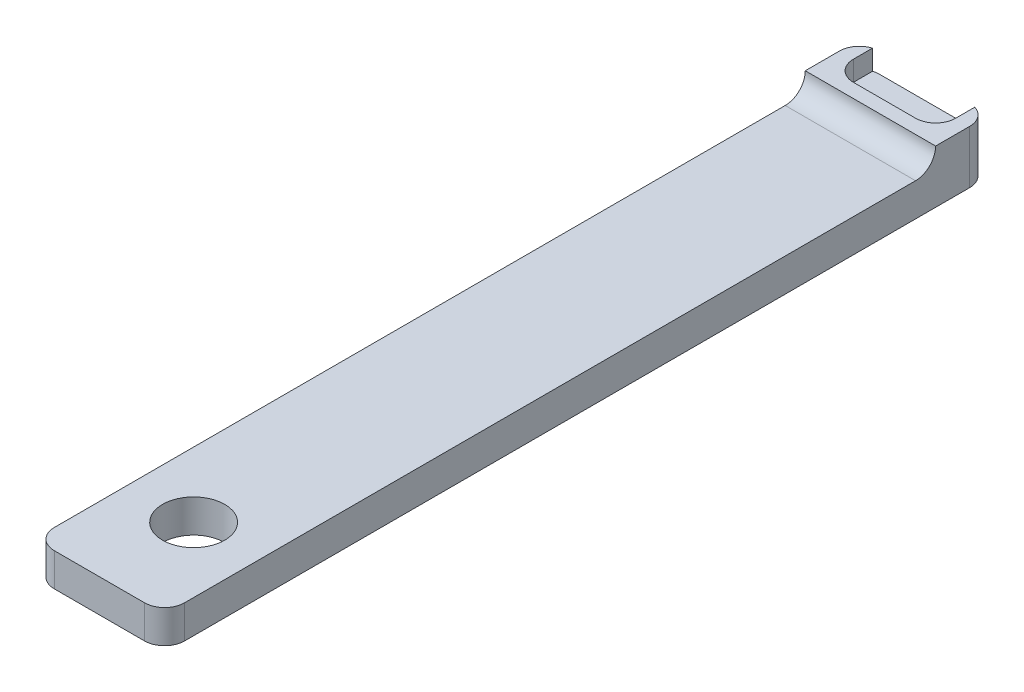
ISO-10303-21;
HEADER;
FILE_DESCRIPTION(('STEP AP214'),'2;1');
FILE_NAME('part.step','',(''),(''),'','','');
FILE_SCHEMA(('AUTOMOTIVE_DESIGN { 1 0 10303 214 1 1 1 1 }'));
ENDSEC;
DATA;
#1=APPLICATION_CONTEXT('core data for automotive mechanical design processes');
#2=APPLICATION_PROTOCOL_DEFINITION('international standard','automotive_design',2000,#1);
#3=PRODUCT_CONTEXT('',#1,'mechanical');
#4=PRODUCT('Part','Part','',(#3));
#5=PRODUCT_RELATED_PRODUCT_CATEGORY('part','',(#4));
#6=PRODUCT_DEFINITION_FORMATION('','',#4);
#7=PRODUCT_DEFINITION_CONTEXT('part definition',#1,'design');
#8=PRODUCT_DEFINITION('design','',#6,#7);
#9=PRODUCT_DEFINITION_SHAPE('','',#8);
#10=(LENGTH_UNIT() NAMED_UNIT(*) SI_UNIT(.MILLI.,.METRE.));
#11=(NAMED_UNIT(*) PLANE_ANGLE_UNIT() SI_UNIT($,.RADIAN.));
#12=(NAMED_UNIT(*) SI_UNIT($,.STERADIAN.) SOLID_ANGLE_UNIT());
#13=UNCERTAINTY_MEASURE_WITH_UNIT(LENGTH_MEASURE(1.E-05),#10,'distance_accuracy_value','');
#14=(GEOMETRIC_REPRESENTATION_CONTEXT(3) GLOBAL_UNCERTAINTY_ASSIGNED_CONTEXT((#13)) GLOBAL_UNIT_ASSIGNED_CONTEXT((#10,
#11,#12)) REPRESENTATION_CONTEXT('',''));
#15=CARTESIAN_POINT('',(0.,0.,0.));
#16=DIRECTION('',(0.,0.,1.));
#17=DIRECTION('',(1.,0.,0.));
#18=AXIS2_PLACEMENT_3D('',#15,#16,#17);
#19=CARTESIAN_POINT('',(0.,1.65,0.));
#20=DIRECTION('',(0.,-1.,0.));
#21=DIRECTION('',(0.,0.,-1.));
#22=AXIS2_PLACEMENT_3D('',#19,#20,#21);
#23=PLANE('',#22);
#24=DIRECTION('',(0.,0.,1.));
#25=VECTOR('',#24,1.);
#26=CARTESIAN_POINT('',(5.8,1.65,-41.15));
#27=LINE('',#26,#25);
#28=CARTESIAN_POINT('',(5.8,1.65,-41.1039392014169));
#29=VERTEX_POINT('',#28);
#30=CARTESIAN_POINT('',(5.8,1.65,-40.15));
#31=VERTEX_POINT('',#30);
#32=EDGE_CURVE('E191',#29,#31,#27,.T.);
#33=ORIENTED_EDGE('',*,*,#32,.F.);
#34=CARTESIAN_POINT('',(5.5,1.65,-40.15));
#35=DIRECTION('',(0.,-1.,0.));
#36=DIRECTION('',(0.,0.,-1.));
#37=AXIS2_PLACEMENT_3D('',#34,#35,#36);
#38=CIRCLE('',#37,1.);
#39=CARTESIAN_POINT('',(5.5,1.65,-41.15));
#40=VERTEX_POINT('',#39);
#41=EDGE_CURVE('E255',#29,#40,#38,.F.);
#42=ORIENTED_EDGE('',*,*,#41,.T.);
#43=DIRECTION('',(-1.,0.,0.));
#44=VECTOR('',#43,1.);
#45=CARTESIAN_POINT('',(0.,1.65,-41.15));
#46=LINE('',#45,#44);
#47=CARTESIAN_POINT('',(1.,1.65,-41.15));
#48=VERTEX_POINT('',#47);
#49=EDGE_CURVE('E212',#40,#48,#46,.T.);
#50=ORIENTED_EDGE('',*,*,#49,.T.);
#51=CARTESIAN_POINT('',(1.,1.65,-40.15));
#52=DIRECTION('',(0.,-1.,0.));
#53=DIRECTION('',(0.,0.,-1.));
#54=AXIS2_PLACEMENT_3D('',#51,#52,#53);
#55=CIRCLE('',#54,1.);
#56=CARTESIAN_POINT('',(0.7,1.65,-41.1039392014169));
#57=VERTEX_POINT('',#56);
#58=EDGE_CURVE('E253',#48,#57,#55,.F.);
#59=ORIENTED_EDGE('',*,*,#58,.T.);
#60=DIRECTION('',(0.,0.,-1.));
#61=VECTOR('',#60,1.);
#62=CARTESIAN_POINT('',(0.7,1.65,-41.15));
#63=LINE('',#62,#61);
#64=CARTESIAN_POINT('',(0.7,1.65,-40.15));
#65=VERTEX_POINT('',#64);
#66=EDGE_CURVE('E175',#65,#57,#63,.T.);
#67=ORIENTED_EDGE('',*,*,#66,.F.);
#68=CARTESIAN_POINT('',(1.7,1.65,-40.15));
#69=DIRECTION('',(0.,-1.,0.));
#70=DIRECTION('',(0.,0.,-1.));
#71=AXIS2_PLACEMENT_3D('',#68,#69,#70);
#72=CIRCLE('',#71,1.);
#73=CARTESIAN_POINT('',(1.7,1.65,-39.15));
#74=VERTEX_POINT('',#73);
#75=EDGE_CURVE('E251',#65,#74,#72,.F.);
#76=ORIENTED_EDGE('',*,*,#75,.T.);
#77=DIRECTION('',(-1.,0.,0.));
#78=VECTOR('',#77,1.);
#79=CARTESIAN_POINT('',(0.7,1.65,-39.15));
#80=LINE('',#79,#78);
#81=CARTESIAN_POINT('',(4.8,1.65,-39.15));
#82=VERTEX_POINT('',#81);
#83=EDGE_CURVE('E194',#82,#74,#80,.T.);
#84=ORIENTED_EDGE('',*,*,#83,.F.);
#85=CARTESIAN_POINT('',(4.8,1.65,-40.15));
#86=DIRECTION('',(0.,-1.,0.));
#87=DIRECTION('',(0.,0.,-1.));
#88=AXIS2_PLACEMENT_3D('',#85,#86,#87);
#89=CIRCLE('',#88,1.);
#90=EDGE_CURVE('E249',#82,#31,#89,.F.);
#91=ORIENTED_EDGE('',*,*,#90,.T.);
#92=EDGE_LOOP('',(#33,#42,#50,#59,#67,#76,#84,#91));
#93=FACE_BOUND('',#92,.T.);
#94=ADVANCED_FACE('F39',(#93),#23,.F.);
#95=CARTESIAN_POINT('',(3.25,1.65,-4.7));
#96=DIRECTION('',(0.,1.,0.));
#97=DIRECTION('',(0.,0.,1.));
#98=AXIS2_PLACEMENT_3D('',#95,#96,#97);
#99=CIRCLE('',#98,1.55);
#100=CARTESIAN_POINT('',(3.25,1.65,-3.15));
#101=VERTEX_POINT('',#100);
#102=EDGE_CURVE('E199',#101,#101,#99,.T.);
#103=ORIENTED_EDGE('',*,*,#102,.F.);
#104=EDGE_LOOP('',(#103));
#105=FACE_BOUND('',#104,.T.);
#106=DIRECTION('',(1.,0.,0.));
#107=VECTOR('',#106,1.);
#108=CARTESIAN_POINT('',(0.,1.65,0.));
#109=LINE('',#108,#107);
#110=CARTESIAN_POINT('',(1.,1.65,0.));
#111=VERTEX_POINT('',#110);
#112=CARTESIAN_POINT('',(5.5,1.65,0.));
#113=VERTEX_POINT('',#112);
#114=EDGE_CURVE('E206',#111,#113,#109,.T.);
#115=ORIENTED_EDGE('',*,*,#114,.T.);
#116=CARTESIAN_POINT('',(5.5,1.65,-1.));
#117=DIRECTION('',(0.,-1.,0.));
#118=DIRECTION('',(0.,0.,-1.));
#119=AXIS2_PLACEMENT_3D('',#116,#117,#118);
#120=CIRCLE('',#119,1.);
#121=CARTESIAN_POINT('',(6.5,1.65,-1.));
#122=VERTEX_POINT('',#121);
#123=EDGE_CURVE('E273',#113,#122,#120,.F.);
#124=ORIENTED_EDGE('',*,*,#123,.T.);
#125=DIRECTION('',(0.,0.,-1.));
#126=VECTOR('',#125,1.);
#127=CARTESIAN_POINT('',(6.5,1.65,0.));
#128=LINE('',#127,#126);
#129=CARTESIAN_POINT('',(6.5,1.65,-37.45));
#130=VERTEX_POINT('',#129);
#131=EDGE_CURVE('E209',#122,#130,#128,.T.);
#132=ORIENTED_EDGE('',*,*,#131,.T.);
#133=DIRECTION('',(1.,0.,0.));
#134=VECTOR('',#133,1.);
#135=CARTESIAN_POINT('',(0.,1.65,-37.45));
#136=LINE('',#135,#134);
#137=CARTESIAN_POINT('',(0.,1.65,-37.45));
#138=VERTEX_POINT('',#137);
#139=EDGE_CURVE('E270',#130,#138,#136,.F.);
#140=ORIENTED_EDGE('',*,*,#139,.T.);
#141=DIRECTION('',(0.,0.,1.));
#142=VECTOR('',#141,1.);
#143=CARTESIAN_POINT('',(0.,1.65,0.));
#144=LINE('',#143,#142);
#145=CARTESIAN_POINT('',(0.,1.65,-1.));
#146=VERTEX_POINT('',#145);
#147=EDGE_CURVE('E160',#138,#146,#144,.T.);
#148=ORIENTED_EDGE('',*,*,#147,.T.);
#149=CARTESIAN_POINT('',(1.,1.65,-1.));
#150=DIRECTION('',(0.,-1.,0.));
#151=DIRECTION('',(0.,0.,-1.));
#152=AXIS2_PLACEMENT_3D('',#149,#150,#151);
#153=CIRCLE('',#152,1.);
#154=EDGE_CURVE('E61',#146,#111,#153,.F.);
#155=ORIENTED_EDGE('',*,*,#154,.T.);
#156=EDGE_LOOP('',(#115,#124,#132,#140,#148,#155));
#157=FACE_BOUND('',#156,.T.);
#158=ADVANCED_FACE('F329',(#105,#157),#23,.F.);
#159=CARTESIAN_POINT('',(0.,0.,0.));
#160=DIRECTION('',(0.,-1.,0.));
#161=DIRECTION('',(0.,0.,-1.));
#162=AXIS2_PLACEMENT_3D('',#159,#160,#161);
#163=PLANE('',#162);
#164=DIRECTION('',(-1.,0.,0.));
#165=VECTOR('',#164,1.);
#166=CARTESIAN_POINT('',(0.,0.,-41.15));
#167=LINE('',#166,#165);
#168=CARTESIAN_POINT('',(5.5,0.,-41.15));
#169=VERTEX_POINT('',#168);
#170=CARTESIAN_POINT('',(1.,0.,-41.15));
#171=VERTEX_POINT('',#170);
#172=EDGE_CURVE('E207',#169,#171,#167,.T.);
#173=ORIENTED_EDGE('',*,*,#172,.F.);
#174=CARTESIAN_POINT('',(5.5,0.,-40.15));
#175=DIRECTION('',(0.,-1.,0.));
#176=DIRECTION('',(0.,0.,-1.));
#177=AXIS2_PLACEMENT_3D('',#174,#175,#176);
#178=CIRCLE('',#177,1.);
#179=CARTESIAN_POINT('',(6.5,0.,-40.15));
#180=VERTEX_POINT('',#179);
#181=EDGE_CURVE('E235',#169,#180,#178,.T.);
#182=ORIENTED_EDGE('',*,*,#181,.T.);
#183=DIRECTION('',(0.,0.,-1.));
#184=VECTOR('',#183,1.);
#185=CARTESIAN_POINT('',(6.5,0.,0.));
#186=LINE('',#185,#184);
#187=CARTESIAN_POINT('',(6.5,0.,-1.));
#188=VERTEX_POINT('',#187);
#189=EDGE_CURVE('E220',#188,#180,#186,.T.);
#190=ORIENTED_EDGE('',*,*,#189,.F.);
#191=CARTESIAN_POINT('',(5.5,0.,-1.));
#192=DIRECTION('',(0.,-1.,0.));
#193=DIRECTION('',(0.,0.,-1.));
#194=AXIS2_PLACEMENT_3D('',#191,#192,#193);
#195=CIRCLE('',#194,1.);
#196=CARTESIAN_POINT('',(5.5,0.,0.));
#197=VERTEX_POINT('',#196);
#198=EDGE_CURVE('E231',#188,#197,#195,.T.);
#199=ORIENTED_EDGE('',*,*,#198,.T.);
#200=DIRECTION('',(1.,0.,0.));
#201=VECTOR('',#200,1.);
#202=CARTESIAN_POINT('',(0.,0.,0.));
#203=LINE('',#202,#201);
#204=CARTESIAN_POINT('',(1.,0.,0.));
#205=VERTEX_POINT('',#204);
#206=EDGE_CURVE('E218',#205,#197,#203,.T.);
#207=ORIENTED_EDGE('',*,*,#206,.F.);
#208=CARTESIAN_POINT('',(1.,0.,-1.));
#209=DIRECTION('',(0.,-1.,0.));
#210=DIRECTION('',(0.,0.,-1.));
#211=AXIS2_PLACEMENT_3D('',#208,#209,#210);
#212=CIRCLE('',#211,1.);
#213=CARTESIAN_POINT('',(0.,0.,-1.));
#214=VERTEX_POINT('',#213);
#215=EDGE_CURVE('E229',#205,#214,#212,.T.);
#216=ORIENTED_EDGE('',*,*,#215,.T.);
#217=DIRECTION('',(0.,0.,1.));
#218=VECTOR('',#217,1.);
#219=CARTESIAN_POINT('',(0.,0.,0.));
#220=LINE('',#219,#218);
#221=CARTESIAN_POINT('',(0.,0.,-40.15));
#222=VERTEX_POINT('',#221);
#223=EDGE_CURVE('E202',#222,#214,#220,.T.);
#224=ORIENTED_EDGE('',*,*,#223,.F.);
#225=CARTESIAN_POINT('',(1.,0.,-40.15));
#226=DIRECTION('',(0.,-1.,0.));
#227=DIRECTION('',(0.,0.,-1.));
#228=AXIS2_PLACEMENT_3D('',#225,#226,#227);
#229=CIRCLE('',#228,1.);
#230=EDGE_CURVE('E233',#222,#171,#229,.T.);
#231=ORIENTED_EDGE('',*,*,#230,.T.);
#232=EDGE_LOOP('',(#173,#182,#190,#199,#207,#216,#224,#231));
#233=FACE_BOUND('',#232,.T.);
#234=CARTESIAN_POINT('',(3.25,0.,-4.7));
#235=DIRECTION('',(0.,1.,0.));
#236=DIRECTION('',(0.,0.,1.));
#237=AXIS2_PLACEMENT_3D('',#234,#235,#236);
#238=CIRCLE('',#237,1.55);
#239=CARTESIAN_POINT('',(3.25,0.,-3.15));
#240=VERTEX_POINT('',#239);
#241=EDGE_CURVE('E190',#240,#240,#238,.T.);
#242=ORIENTED_EDGE('',*,*,#241,.T.);
#243=EDGE_LOOP('',(#242));
#244=FACE_BOUND('',#243,.T.);
#245=ADVANCED_FACE('F321',(#233,#244),#163,.T.);
#246=CARTESIAN_POINT('',(0.,1.65,0.));
#247=DIRECTION('',(1.,0.,0.));
#248=DIRECTION('',(0.,0.,-1.));
#249=AXIS2_PLACEMENT_3D('',#246,#247,#248);
#250=PLANE('',#249);
#251=DIRECTION('',(0.,0.,1.));
#252=VECTOR('',#251,1.);
#253=CARTESIAN_POINT('',(0.,2.65,-41.15));
#254=LINE('',#253,#252);
#255=CARTESIAN_POINT('',(0.,2.65,-40.15));
#256=VERTEX_POINT('',#255);
#257=CARTESIAN_POINT('',(0.,2.65,-38.45));
#258=VERTEX_POINT('',#257);
#259=EDGE_CURVE('E158',#256,#258,#254,.T.);
#260=ORIENTED_EDGE('',*,*,#259,.F.);
#261=DIRECTION('',(0.,-1.,0.));
#262=VECTOR('',#261,1.);
#263=CARTESIAN_POINT('',(0.,1.65,-40.15));
#264=LINE('',#263,#262);
#265=EDGE_CURVE('E259',#256,#222,#264,.T.);
#266=ORIENTED_EDGE('',*,*,#265,.T.);
#267=ORIENTED_EDGE('',*,*,#223,.T.);
#268=DIRECTION('',(0.,-1.,0.));
#269=VECTOR('',#268,1.);
#270=CARTESIAN_POINT('',(0.,1.65,-1.));
#271=LINE('',#270,#269);
#272=EDGE_CURVE('E257',#214,#146,#271,.F.);
#273=ORIENTED_EDGE('',*,*,#272,.T.);
#274=ORIENTED_EDGE('',*,*,#147,.F.);
#275=CARTESIAN_POINT('',(0.,2.65,-37.45));
#276=DIRECTION('',(1.,0.,0.));
#277=DIRECTION('',(0.,0.,-1.));
#278=AXIS2_PLACEMENT_3D('',#275,#276,#277);
#279=CIRCLE('',#278,1.);
#280=EDGE_CURVE('E154',#138,#258,#279,.T.);
#281=ORIENTED_EDGE('',*,*,#280,.T.);
#282=EDGE_LOOP('',(#260,#266,#267,#273,#274,#281));
#283=FACE_BOUND('',#282,.T.);
#284=ADVANCED_FACE('F156',(#283),#250,.F.);
#285=CARTESIAN_POINT('',(0.,1.65,0.));
#286=DIRECTION('',(0.,0.,-1.));
#287=DIRECTION('',(-1.,0.,0.));
#288=AXIS2_PLACEMENT_3D('',#285,#286,#287);
#289=PLANE('',#288);
#290=ORIENTED_EDGE('',*,*,#206,.T.);
#291=DIRECTION('',(0.,-1.,0.));
#292=VECTOR('',#291,1.);
#293=CARTESIAN_POINT('',(5.5,1.65,0.));
#294=LINE('',#293,#292);
#295=EDGE_CURVE('E54',#197,#113,#294,.F.);
#296=ORIENTED_EDGE('',*,*,#295,.T.);
#297=ORIENTED_EDGE('',*,*,#114,.F.);
#298=DIRECTION('',(0.,-1.,0.));
#299=VECTOR('',#298,1.);
#300=CARTESIAN_POINT('',(1.,1.65,0.));
#301=LINE('',#300,#299);
#302=EDGE_CURVE('E266',#111,#205,#301,.T.);
#303=ORIENTED_EDGE('',*,*,#302,.T.);
#304=EDGE_LOOP('',(#290,#296,#297,#303));
#305=FACE_BOUND('',#304,.T.);
#306=ADVANCED_FACE('F327',(#305),#289,.F.);
#307=CARTESIAN_POINT('',(6.5,1.65,0.));
#308=DIRECTION('',(-1.,0.,0.));
#309=DIRECTION('',(0.,0.,1.));
#310=AXIS2_PLACEMENT_3D('',#307,#308,#309);
#311=PLANE('',#310);
#312=ORIENTED_EDGE('',*,*,#189,.T.);
#313=DIRECTION('',(0.,-1.,0.));
#314=VECTOR('',#313,1.);
#315=CARTESIAN_POINT('',(6.5,1.65,-40.15));
#316=LINE('',#315,#314);
#317=CARTESIAN_POINT('',(6.5,2.65,-40.15));
#318=VERTEX_POINT('',#317);
#319=EDGE_CURVE('E240',#180,#318,#316,.F.);
#320=ORIENTED_EDGE('',*,*,#319,.T.);
#321=DIRECTION('',(0.,0.,-1.));
#322=VECTOR('',#321,1.);
#323=CARTESIAN_POINT('',(6.5,2.65,-39.15));
#324=LINE('',#323,#322);
#325=CARTESIAN_POINT('',(6.5,2.65,-38.45));
#326=VERTEX_POINT('',#325);
#327=EDGE_CURVE('E178',#326,#318,#324,.T.);
#328=ORIENTED_EDGE('',*,*,#327,.F.);
#329=CARTESIAN_POINT('',(6.5,2.65,-37.45));
#330=DIRECTION('',(-1.,0.,0.));
#331=DIRECTION('',(0.,0.,1.));
#332=AXIS2_PLACEMENT_3D('',#329,#330,#331);
#333=CIRCLE('',#332,1.);
#334=EDGE_CURVE('E164',#326,#130,#333,.T.);
#335=ORIENTED_EDGE('',*,*,#334,.T.);
#336=ORIENTED_EDGE('',*,*,#131,.F.);
#337=DIRECTION('',(0.,-1.,0.));
#338=VECTOR('',#337,1.);
#339=CARTESIAN_POINT('',(6.5,1.65,-1.));
#340=LINE('',#339,#338);
#341=EDGE_CURVE('E237',#122,#188,#340,.T.);
#342=ORIENTED_EDGE('',*,*,#341,.T.);
#343=EDGE_LOOP('',(#312,#320,#328,#335,#336,#342));
#344=FACE_BOUND('',#343,.T.);
#345=ADVANCED_FACE('F336',(#344),#311,.F.);
#346=CARTESIAN_POINT('',(0.,1.65,-41.15));
#347=DIRECTION('',(0.,0.,1.));
#348=DIRECTION('',(1.,0.,0.));
#349=AXIS2_PLACEMENT_3D('',#346,#347,#348);
#350=PLANE('',#349);
#351=ORIENTED_EDGE('',*,*,#49,.F.);
#352=DIRECTION('',(0.,-1.,0.));
#353=VECTOR('',#352,1.);
#354=CARTESIAN_POINT('',(5.5,1.65,-41.15));
#355=LINE('',#354,#353);
#356=EDGE_CURVE('E226',#40,#169,#355,.T.);
#357=ORIENTED_EDGE('',*,*,#356,.T.);
#358=ORIENTED_EDGE('',*,*,#172,.T.);
#359=DIRECTION('',(0.,-1.,0.));
#360=VECTOR('',#359,1.);
#361=CARTESIAN_POINT('',(1.,1.65,-41.15));
#362=LINE('',#361,#360);
#363=EDGE_CURVE('E215',#171,#48,#362,.F.);
#364=ORIENTED_EDGE('',*,*,#363,.T.);
#365=EDGE_LOOP('',(#351,#357,#358,#364));
#366=FACE_BOUND('',#365,.T.);
#367=ADVANCED_FACE('F313',(#366),#350,.F.);
#368=CARTESIAN_POINT('',(3.25,1.65,-4.7));
#369=DIRECTION('',(0.,-1.,0.));
#370=DIRECTION('',(0.,0.,-1.));
#371=AXIS2_PLACEMENT_3D('',#368,#369,#370);
#372=CYLINDRICAL_SURFACE('',#371,1.55);
#373=ORIENTED_EDGE('',*,*,#102,.T.);
#374=EDGE_LOOP('',(#373));
#375=FACE_BOUND('',#374,.T.);
#376=ORIENTED_EDGE('',*,*,#241,.F.);
#377=EDGE_LOOP('',(#376));
#378=FACE_BOUND('',#377,.T.);
#379=ADVANCED_FACE('F343',(#375,#378),#372,.F.);
#380=CARTESIAN_POINT('',(5.8,2.65,-41.15));
#381=DIRECTION('',(1.,0.,0.));
#382=DIRECTION('',(0.,0.,-1.));
#383=AXIS2_PLACEMENT_3D('',#380,#381,#382);
#384=PLANE('',#383);
#385=DIRECTION('',(0.,0.,1.));
#386=VECTOR('',#385,1.);
#387=CARTESIAN_POINT('',(5.8,2.65,-41.15));
#388=LINE('',#387,#386);
#389=CARTESIAN_POINT('',(5.8,2.65,-41.1039392014169));
#390=VERTEX_POINT('',#389);
#391=CARTESIAN_POINT('',(5.8,2.65,-40.15));
#392=VERTEX_POINT('',#391);
#393=EDGE_CURVE('E180',#390,#392,#388,.T.);
#394=ORIENTED_EDGE('',*,*,#393,.F.);
#395=DIRECTION('',(0.,-1.,0.));
#396=VECTOR('',#395,1.);
#397=CARTESIAN_POINT('',(5.8,2.65,-41.1039392014169));
#398=LINE('',#397,#396);
#399=EDGE_CURVE('E247',#390,#29,#398,.T.);
#400=ORIENTED_EDGE('',*,*,#399,.T.);
#401=ORIENTED_EDGE('',*,*,#32,.T.);
#402=DIRECTION('',(0.,-1.,0.));
#403=VECTOR('',#402,1.);
#404=CARTESIAN_POINT('',(5.8,2.65,-40.15));
#405=LINE('',#404,#403);
#406=EDGE_CURVE('E245',#31,#392,#405,.F.);
#407=ORIENTED_EDGE('',*,*,#406,.T.);
#408=EDGE_LOOP('',(#394,#400,#401,#407));
#409=FACE_BOUND('',#408,.T.);
#410=ADVANCED_FACE('F303',(#409),#384,.F.);
#411=CARTESIAN_POINT('',(0.7,2.65,-39.15));
#412=DIRECTION('',(0.,0.,1.));
#413=DIRECTION('',(1.,0.,0.));
#414=AXIS2_PLACEMENT_3D('',#411,#412,#413);
#415=PLANE('',#414);
#416=ORIENTED_EDGE('',*,*,#83,.T.);
#417=DIRECTION('',(0.,-1.,0.));
#418=VECTOR('',#417,1.);
#419=CARTESIAN_POINT('',(1.7,2.65,-39.15));
#420=LINE('',#419,#418);
#421=CARTESIAN_POINT('',(1.7,2.65,-39.15));
#422=VERTEX_POINT('',#421);
#423=EDGE_CURVE('E278',#74,#422,#420,.F.);
#424=ORIENTED_EDGE('',*,*,#423,.T.);
#425=DIRECTION('',(-1.,0.,0.));
#426=VECTOR('',#425,1.);
#427=CARTESIAN_POINT('',(0.7,2.65,-39.15));
#428=LINE('',#427,#426);
#429=CARTESIAN_POINT('',(4.8,2.65,-39.15));
#430=VERTEX_POINT('',#429);
#431=EDGE_CURVE('E185',#430,#422,#428,.T.);
#432=ORIENTED_EDGE('',*,*,#431,.F.);
#433=DIRECTION('',(0.,-1.,0.));
#434=VECTOR('',#433,1.);
#435=CARTESIAN_POINT('',(4.8,1.65,-39.15));
#436=LINE('',#435,#434);
#437=EDGE_CURVE('E275',#430,#82,#436,.T.);
#438=ORIENTED_EDGE('',*,*,#437,.T.);
#439=EDGE_LOOP('',(#416,#424,#432,#438));
#440=FACE_BOUND('',#439,.T.);
#441=ADVANCED_FACE('F295',(#440),#415,.F.);
#442=CARTESIAN_POINT('',(0.7,2.65,-41.15));
#443=DIRECTION('',(-1.,0.,0.));
#444=DIRECTION('',(0.,0.,1.));
#445=AXIS2_PLACEMENT_3D('',#442,#443,#444);
#446=PLANE('',#445);
#447=ORIENTED_EDGE('',*,*,#66,.T.);
#448=DIRECTION('',(0.,-1.,0.));
#449=VECTOR('',#448,1.);
#450=CARTESIAN_POINT('',(0.7,1.65,-41.1039392014169));
#451=LINE('',#450,#449);
#452=CARTESIAN_POINT('',(0.7,2.65,-41.1039392014169));
#453=VERTEX_POINT('',#452);
#454=EDGE_CURVE('E264',#57,#453,#451,.F.);
#455=ORIENTED_EDGE('',*,*,#454,.T.);
#456=DIRECTION('',(0.,0.,-1.));
#457=VECTOR('',#456,1.);
#458=CARTESIAN_POINT('',(0.7,2.65,-41.15));
#459=LINE('',#458,#457);
#460=CARTESIAN_POINT('',(0.7,2.65,-40.15));
#461=VERTEX_POINT('',#460);
#462=EDGE_CURVE('E188',#461,#453,#459,.T.);
#463=ORIENTED_EDGE('',*,*,#462,.F.);
#464=DIRECTION('',(0.,-1.,0.));
#465=VECTOR('',#464,1.);
#466=CARTESIAN_POINT('',(0.7,1.65,-40.15));
#467=LINE('',#466,#465);
#468=EDGE_CURVE('E261',#461,#65,#467,.T.);
#469=ORIENTED_EDGE('',*,*,#468,.T.);
#470=EDGE_LOOP('',(#447,#455,#463,#469));
#471=FACE_BOUND('',#470,.T.);
#472=ADVANCED_FACE('F287',(#471),#446,.F.);
#473=CARTESIAN_POINT('',(0.,2.65,0.));
#474=DIRECTION('',(0.,1.,0.));
#475=DIRECTION('',(0.,0.,1.));
#476=AXIS2_PLACEMENT_3D('',#473,#474,#475);
#477=PLANE('',#476);
#478=ORIENTED_EDGE('',*,*,#327,.T.);
#479=CARTESIAN_POINT('',(5.5,2.65,-40.15));
#480=DIRECTION('',(0.,1.,0.));
#481=DIRECTION('',(0.,0.,1.));
#482=AXIS2_PLACEMENT_3D('',#479,#480,#481);
#483=CIRCLE('',#482,1.);
#484=EDGE_CURVE('E243',#318,#390,#483,.T.);
#485=ORIENTED_EDGE('',*,*,#484,.T.);
#486=ORIENTED_EDGE('',*,*,#393,.T.);
#487=CARTESIAN_POINT('',(4.8,2.65,-40.15));
#488=DIRECTION('',(0.,1.,0.));
#489=DIRECTION('',(0.,0.,1.));
#490=AXIS2_PLACEMENT_3D('',#487,#488,#489);
#491=CIRCLE('',#490,1.);
#492=EDGE_CURVE('E11',#392,#430,#491,.F.);
#493=ORIENTED_EDGE('',*,*,#492,.T.);
#494=ORIENTED_EDGE('',*,*,#431,.T.);
#495=CARTESIAN_POINT('',(1.7,2.65,-40.15));
#496=DIRECTION('',(0.,1.,0.));
#497=DIRECTION('',(0.,0.,1.));
#498=AXIS2_PLACEMENT_3D('',#495,#496,#497);
#499=CIRCLE('',#498,1.);
#500=EDGE_CURVE('E47',#422,#461,#499,.F.);
#501=ORIENTED_EDGE('',*,*,#500,.T.);
#502=ORIENTED_EDGE('',*,*,#462,.T.);
#503=CARTESIAN_POINT('',(1.,2.65,-40.15));
#504=DIRECTION('',(0.,1.,0.));
#505=DIRECTION('',(0.,0.,1.));
#506=AXIS2_PLACEMENT_3D('',#503,#504,#505);
#507=CIRCLE('',#506,1.);
#508=EDGE_CURVE('E174',#453,#256,#507,.T.);
#509=ORIENTED_EDGE('',*,*,#508,.T.);
#510=ORIENTED_EDGE('',*,*,#259,.T.);
#511=DIRECTION('',(1.,0.,0.));
#512=VECTOR('',#511,1.);
#513=CARTESIAN_POINT('',(0.,2.65,-38.45));
#514=LINE('',#513,#512);
#515=EDGE_CURVE('E170',#258,#326,#514,.T.);
#516=ORIENTED_EDGE('',*,*,#515,.T.);
#517=EDGE_LOOP('',(#478,#485,#486,#493,#494,#501,#502,#509,#510,#516));
#518=FACE_BOUND('',#517,.T.);
#519=ADVANCED_FACE('F169',(#518),#477,.T.);
#520=CARTESIAN_POINT('',(5.5,1.65,-40.15));
#521=DIRECTION('',(0.,-1.,0.));
#522=DIRECTION('',(0.,0.,-1.));
#523=AXIS2_PLACEMENT_3D('',#520,#521,#522);
#524=CYLINDRICAL_SURFACE('',#523,1.);
#525=ORIENTED_EDGE('',*,*,#484,.F.);
#526=ORIENTED_EDGE('',*,*,#319,.F.);
#527=ORIENTED_EDGE('',*,*,#181,.F.);
#528=ORIENTED_EDGE('',*,*,#356,.F.);
#529=ORIENTED_EDGE('',*,*,#41,.F.);
#530=ORIENTED_EDGE('',*,*,#399,.F.);
#531=EDGE_LOOP('',(#525,#526,#527,#528,#529,#530));
#532=FACE_BOUND('',#531,.T.);
#533=ADVANCED_FACE('F307',(#532),#524,.T.);
#534=CARTESIAN_POINT('',(1.,1.65,-40.15));
#535=DIRECTION('',(0.,-1.,0.));
#536=DIRECTION('',(0.,0.,-1.));
#537=AXIS2_PLACEMENT_3D('',#534,#535,#536);
#538=CYLINDRICAL_SURFACE('',#537,1.);
#539=ORIENTED_EDGE('',*,*,#58,.F.);
#540=ORIENTED_EDGE('',*,*,#363,.F.);
#541=ORIENTED_EDGE('',*,*,#230,.F.);
#542=ORIENTED_EDGE('',*,*,#265,.F.);
#543=ORIENTED_EDGE('',*,*,#508,.F.);
#544=ORIENTED_EDGE('',*,*,#454,.F.);
#545=EDGE_LOOP('',(#539,#540,#541,#542,#543,#544));
#546=FACE_BOUND('',#545,.T.);
#547=ADVANCED_FACE('F317',(#546),#538,.T.);
#548=CARTESIAN_POINT('',(5.5,1.65,-1.));
#549=DIRECTION('',(0.,-1.,0.));
#550=DIRECTION('',(0.,0.,-1.));
#551=AXIS2_PLACEMENT_3D('',#548,#549,#550);
#552=CYLINDRICAL_SURFACE('',#551,1.);
#553=ORIENTED_EDGE('',*,*,#123,.F.);
#554=ORIENTED_EDGE('',*,*,#295,.F.);
#555=ORIENTED_EDGE('',*,*,#198,.F.);
#556=ORIENTED_EDGE('',*,*,#341,.F.);
#557=EDGE_LOOP('',(#553,#554,#555,#556));
#558=FACE_BOUND('',#557,.T.);
#559=ADVANCED_FACE('F333',(#558),#552,.T.);
#560=CARTESIAN_POINT('',(1.,1.65,-1.));
#561=DIRECTION('',(0.,-1.,0.));
#562=DIRECTION('',(0.,0.,-1.));
#563=AXIS2_PLACEMENT_3D('',#560,#561,#562);
#564=CYLINDRICAL_SURFACE('',#563,1.);
#565=ORIENTED_EDGE('',*,*,#154,.F.);
#566=ORIENTED_EDGE('',*,*,#272,.F.);
#567=ORIENTED_EDGE('',*,*,#215,.F.);
#568=ORIENTED_EDGE('',*,*,#302,.F.);
#569=EDGE_LOOP('',(#565,#566,#567,#568));
#570=FACE_BOUND('',#569,.T.);
#571=ADVANCED_FACE('F326',(#570),#564,.T.);
#572=CARTESIAN_POINT('',(0.,2.65,-37.45));
#573=DIRECTION('',(-1.,0.,0.));
#574=DIRECTION('',(0.,0.,1.));
#575=AXIS2_PLACEMENT_3D('',#572,#573,#574);
#576=CYLINDRICAL_SURFACE('',#575,1.);
#577=ORIENTED_EDGE('',*,*,#280,.F.);
#578=ORIENTED_EDGE('',*,*,#139,.F.);
#579=ORIENTED_EDGE('',*,*,#334,.F.);
#580=ORIENTED_EDGE('',*,*,#515,.F.);
#581=EDGE_LOOP('',(#577,#578,#579,#580));
#582=FACE_BOUND('',#581,.T.);
#583=ADVANCED_FACE('F177',(#582),#576,.F.);
#584=CARTESIAN_POINT('',(1.7,2.65,-40.15));
#585=DIRECTION('',(0.,1.,0.));
#586=DIRECTION('',(0.,0.,1.));
#587=AXIS2_PLACEMENT_3D('',#584,#585,#586);
#588=CYLINDRICAL_SURFACE('',#587,1.);
#589=ORIENTED_EDGE('',*,*,#500,.F.);
#590=ORIENTED_EDGE('',*,*,#423,.F.);
#591=ORIENTED_EDGE('',*,*,#75,.F.);
#592=ORIENTED_EDGE('',*,*,#468,.F.);
#593=EDGE_LOOP('',(#589,#590,#591,#592));
#594=FACE_BOUND('',#593,.T.);
#595=ADVANCED_FACE('F290',(#594),#588,.F.);
#596=CARTESIAN_POINT('',(4.8,2.65,-40.15));
#597=DIRECTION('',(0.,1.,0.));
#598=DIRECTION('',(0.,0.,1.));
#599=AXIS2_PLACEMENT_3D('',#596,#597,#598);
#600=CYLINDRICAL_SURFACE('',#599,1.);
#601=ORIENTED_EDGE('',*,*,#492,.F.);
#602=ORIENTED_EDGE('',*,*,#406,.F.);
#603=ORIENTED_EDGE('',*,*,#90,.F.);
#604=ORIENTED_EDGE('',*,*,#437,.F.);
#605=EDGE_LOOP('',(#601,#602,#603,#604));
#606=FACE_BOUND('',#605,.T.);
#607=ADVANCED_FACE('F41',(#606),#600,.F.);
#608=CLOSED_SHELL('',(#94,#158,#245,#284,#306,#345,#367,#379,#410,#441,#472,#519,#533,#547,#559,
#571,#583,#595,#607));
#609=MANIFOLD_SOLID_BREP('B2',#608);
#610=ADVANCED_BREP_SHAPE_REPRESENTATION('',(#18,#609),#14);
#611=SHAPE_DEFINITION_REPRESENTATION(#9,#610);
ENDSEC;
END-ISO-10303-21;
